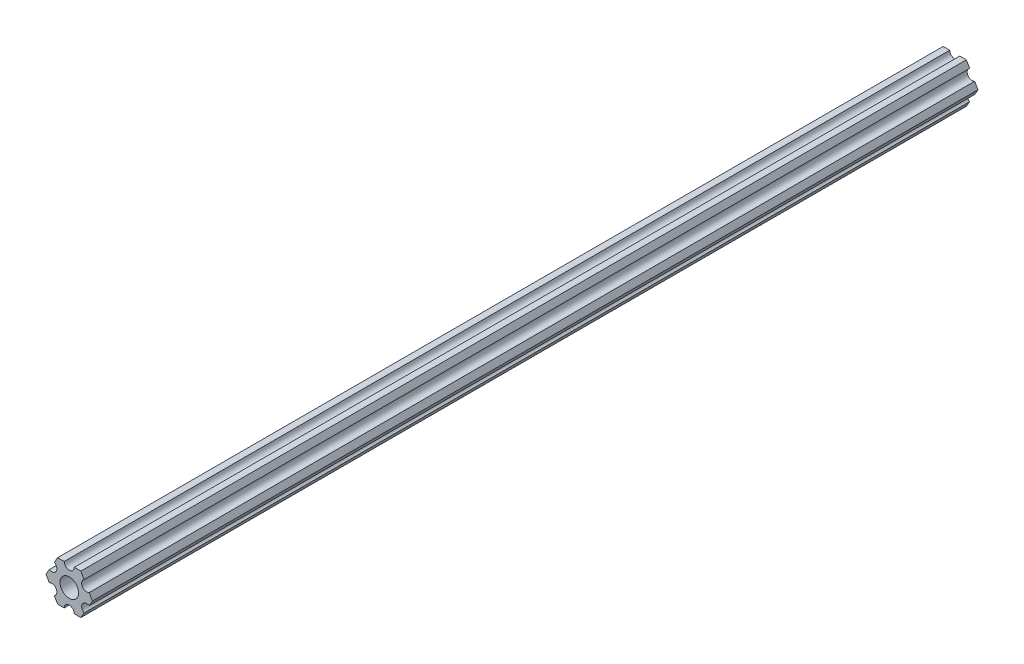
ISO-10303-21;
HEADER;
FILE_DESCRIPTION(('STEP AP214'),'2;1');
FILE_NAME('part.step','',(''),(''),'','','');
FILE_SCHEMA(('AUTOMOTIVE_DESIGN { 1 0 10303 214 1 1 1 1 }'));
ENDSEC;
DATA;
#1=APPLICATION_CONTEXT('core data for automotive mechanical design processes');
#2=APPLICATION_PROTOCOL_DEFINITION('international standard','automotive_design',2000,#1);
#3=PRODUCT_CONTEXT('',#1,'mechanical');
#4=PRODUCT('Part','Part','',(#3));
#5=PRODUCT_RELATED_PRODUCT_CATEGORY('part','',(#4));
#6=PRODUCT_DEFINITION_FORMATION('','',#4);
#7=PRODUCT_DEFINITION_CONTEXT('part definition',#1,'design');
#8=PRODUCT_DEFINITION('design','',#6,#7);
#9=PRODUCT_DEFINITION_SHAPE('','',#8);
#10=(LENGTH_UNIT() NAMED_UNIT(*) SI_UNIT(.MILLI.,.METRE.));
#11=(NAMED_UNIT(*) PLANE_ANGLE_UNIT() SI_UNIT($,.RADIAN.));
#12=(NAMED_UNIT(*) SI_UNIT($,.STERADIAN.) SOLID_ANGLE_UNIT());
#13=UNCERTAINTY_MEASURE_WITH_UNIT(LENGTH_MEASURE(1.E-05),#10,'distance_accuracy_value','');
#14=(GEOMETRIC_REPRESENTATION_CONTEXT(3) GLOBAL_UNCERTAINTY_ASSIGNED_CONTEXT((#13)) GLOBAL_UNIT_ASSIGNED_CONTEXT((#10,
#11,#12)) REPRESENTATION_CONTEXT('',''));
#15=CARTESIAN_POINT('',(0.,0.,0.));
#16=DIRECTION('',(0.,0.,1.));
#17=DIRECTION('',(1.,0.,0.));
#18=AXIS2_PLACEMENT_3D('',#15,#16,#17);
#19=CARTESIAN_POINT('',(6.29301142309098,-1.80018429024546,85.725));
#20=DIRECTION('',(-0.866025434075723,0.499999947533953,0.));
#21=DIRECTION('',(0.,0.,1.));
#22=AXIS2_PLACEMENT_3D('',#19,#20,#21);
#23=PLANE('',#22);
#24=DIRECTION('',(0.,0.,1.));
#25=VECTOR('',#24,1.);
#26=CARTESIAN_POINT('',(7.33234841870827,4.44212519169686E-07,85.725));
#27=LINE('',#26,#25);
#28=CARTESIAN_POINT('',(7.33234841870826,4.44212518961143E-07,-193.675));
#29=VERTEX_POINT('',#28);
#30=CARTESIAN_POINT('',(7.33234841870826,4.44212519315656E-07,85.725));
#31=VERTEX_POINT('',#30);
#32=EDGE_CURVE('E11',#29,#31,#27,.T.);
#33=ORIENTED_EDGE('',*,*,#32,.T.);
#34=DIRECTION('',(0.499999947533953,0.866025434075723,0.));
#35=VECTOR('',#34,1.);
#36=CARTESIAN_POINT('',(6.29301142309098,-1.80018429024546,85.725));
#37=LINE('',#36,#35);
#38=CARTESIAN_POINT('',(6.29301142309098,-1.80018429024546,85.725));
#39=VERTEX_POINT('',#38);
#40=EDGE_CURVE('E301',#39,#31,#37,.T.);
#41=ORIENTED_EDGE('',*,*,#40,.F.);
#42=DIRECTION('',(0.,0.,-1.));
#43=VECTOR('',#42,1.);
#44=CARTESIAN_POINT('',(6.29301142309098,-1.80018429024546,85.725));
#45=LINE('',#44,#43);
#46=CARTESIAN_POINT('',(6.29301142309098,-1.80018429024546,-193.675));
#47=VERTEX_POINT('',#46);
#48=EDGE_CURVE('E300',#39,#47,#45,.T.);
#49=ORIENTED_EDGE('',*,*,#48,.T.);
#50=DIRECTION('',(-0.499999947533953,-0.866025434075723,0.));
#51=VECTOR('',#50,1.);
#52=CARTESIAN_POINT('',(6.29301142309098,-1.80018429024546,-193.675));
#53=LINE('',#52,#51);
#54=EDGE_CURVE('E219',#29,#47,#53,.T.);
#55=ORIENTED_EDGE('',*,*,#54,.F.);
#56=EDGE_LOOP('',(#33,#41,#49,#55));
#57=FACE_BOUND('',#56,.T.);
#58=ADVANCED_FACE('F51',(#57),#23,.F.);
#59=CARTESIAN_POINT('',(7.33234841870827,4.44212519169686E-07,85.725));
#60=DIRECTION('',(-0.866025373493145,-0.500000052466057,0.));
#61=DIRECTION('',(-0.500000052466057,0.866025373493145,0.));
#62=AXIS2_PLACEMENT_3D('',#59,#60,#61);
#63=PLANE('',#62);
#64=DIRECTION('',(0.,0.,1.));
#65=VECTOR('',#64,1.);
#66=CARTESIAN_POINT('',(6.29301120497139,1.80018505273894,85.725));
#67=LINE('',#66,#65);
#68=CARTESIAN_POINT('',(6.29301120497139,1.80018505273894,-193.675));
#69=VERTEX_POINT('',#68);
#70=CARTESIAN_POINT('',(6.29301120497139,1.80018505273894,85.725));
#71=VERTEX_POINT('',#70);
#72=EDGE_CURVE('E59',#69,#71,#67,.T.);
#73=ORIENTED_EDGE('',*,*,#72,.T.);
#74=DIRECTION('',(-0.500000052466057,0.866025373493145,0.));
#75=VECTOR('',#74,1.);
#76=CARTESIAN_POINT('',(7.33234841870827,4.44212519198906E-07,85.725));
#77=LINE('',#76,#75);
#78=EDGE_CURVE('E305',#31,#71,#77,.T.);
#79=ORIENTED_EDGE('',*,*,#78,.F.);
#80=ORIENTED_EDGE('',*,*,#32,.F.);
#81=DIRECTION('',(0.500000052466055,-0.866025373493145,0.));
#82=VECTOR('',#81,1.);
#83=CARTESIAN_POINT('',(7.33234841870826,4.44212518961143E-07,-193.675));
#84=LINE('',#83,#82);
#85=EDGE_CURVE('E213',#69,#29,#84,.T.);
#86=ORIENTED_EDGE('',*,*,#85,.F.);
#87=EDGE_LOOP('',(#73,#79,#80,#86));
#88=FACE_BOUND('',#87,.T.);
#89=ADVANCED_FACE('F214',(#88),#63,.F.);
#90=CARTESIAN_POINT('',(4.70551103839172,4.54981561357972,85.725));
#91=DIRECTION('',(-0.866025373493151,-0.500000052466046,0.));
#92=DIRECTION('',(-0.500000052466046,0.866025373493151,0.));
#93=AXIS2_PLACEMENT_3D('',#90,#91,#92);
#94=PLANE('',#93);
#95=DIRECTION('',(0.,0.,1.));
#96=VECTOR('',#95,1.);
#97=CARTESIAN_POINT('',(3.66617382465481,6.35000022210627,85.725));
#98=LINE('',#97,#96);
#99=CARTESIAN_POINT('',(3.66617382465481,6.35000022210627,-193.675));
#100=VERTEX_POINT('',#99);
#101=CARTESIAN_POINT('',(3.66617382465481,6.35000022210627,85.725));
#102=VERTEX_POINT('',#101);
#103=EDGE_CURVE('E211',#100,#102,#98,.T.);
#104=ORIENTED_EDGE('',*,*,#103,.T.);
#105=DIRECTION('',(-0.500000052466046,0.866025373493151,0.));
#106=VECTOR('',#105,1.);
#107=CARTESIAN_POINT('',(4.70551103839172,4.54981561357972,85.725));
#108=LINE('',#107,#106);
#109=CARTESIAN_POINT('',(4.70551103839172,4.54981561357972,85.725));
#110=VERTEX_POINT('',#109);
#111=EDGE_CURVE('E336',#110,#102,#108,.T.);
#112=ORIENTED_EDGE('',*,*,#111,.F.);
#113=DIRECTION('',(0.,0.,1.));
#114=VECTOR('',#113,1.);
#115=CARTESIAN_POINT('',(4.70551103839172,4.54981561357972,85.725));
#116=LINE('',#115,#114);
#117=CARTESIAN_POINT('',(4.70551103839172,4.54981561357972,-193.675));
#118=VERTEX_POINT('',#117);
#119=EDGE_CURVE('E299',#118,#110,#116,.T.);
#120=ORIENTED_EDGE('',*,*,#119,.F.);
#121=DIRECTION('',(0.500000052466045,-0.866025373493151,0.));
#122=VECTOR('',#121,1.);
#123=CARTESIAN_POINT('',(4.70551103839172,4.54981561357972,-193.675));
#124=LINE('',#123,#122);
#125=EDGE_CURVE('E225',#100,#118,#124,.T.);
#126=ORIENTED_EDGE('',*,*,#125,.F.);
#127=EDGE_LOOP('',(#104,#112,#120,#126));
#128=FACE_BOUND('',#127,.T.);
#129=ADVANCED_FACE('F412',(#128),#94,.F.);
#130=CARTESIAN_POINT('',(3.66617382465481,6.35000022210627,85.725));
#131=DIRECTION('',(6.05825850611185E-08,-1.,0.));
#132=DIRECTION('',(0.,0.,-1.));
#133=AXIS2_PLACEMENT_3D('',#130,#131,#132);
#134=PLANE('',#133);
#135=DIRECTION('',(0.,0.,1.));
#136=VECTOR('',#135,1.);
#137=CARTESIAN_POINT('',(1.58749961530074,6.35000009617482,85.725));
#138=LINE('',#137,#136);
#139=CARTESIAN_POINT('',(1.58749961530073,6.35000015914054,-193.675));
#140=VERTEX_POINT('',#139);
#141=CARTESIAN_POINT('',(1.58749961530073,6.35000015914054,85.725));
#142=VERTEX_POINT('',#141);
#143=EDGE_CURVE('E333',#140,#142,#138,.T.);
#144=ORIENTED_EDGE('',*,*,#143,.T.);
#145=DIRECTION('',(-1.,0.,0.));
#146=VECTOR('',#145,1.);
#147=CARTESIAN_POINT('',(5.49926112168156,6.35000022210627,85.725));
#148=LINE('',#147,#146);
#149=EDGE_CURVE('E340',#102,#142,#148,.T.);
#150=ORIENTED_EDGE('',*,*,#149,.F.);
#151=ORIENTED_EDGE('',*,*,#103,.F.);
#152=DIRECTION('',(1.,3.02912931564594E-08,0.));
#153=VECTOR('',#152,1.);
#154=CARTESIAN_POINT('',(3.66617382465481,6.35000022210627,-193.675));
#155=LINE('',#154,#153);
#156=EDGE_CURVE('E287',#140,#100,#155,.T.);
#157=ORIENTED_EDGE('',*,*,#156,.F.);
#158=EDGE_LOOP('',(#144,#150,#151,#157));
#159=FACE_BOUND('',#158,.T.);
#160=ADVANCED_FACE('F415',(#159),#134,.F.);
#161=CARTESIAN_POINT('',(-3.84699260060323E-07,6.35,85.725));
#162=DIRECTION('',(0.,0.,-1.));
#163=DIRECTION('',(-1.,0.,0.));
#164=AXIS2_PLACEMENT_3D('',#161,#162,#163);
#165=CYLINDRICAL_SURFACE('',#164,1.5875);
#166=DIRECTION('',(0.,0.,1.));
#167=VECTOR('',#166,1.);
#168=CARTESIAN_POINT('',(-1.58750038469926,6.34999990382518,85.725));
#169=LINE('',#168,#167);
#170=CARTESIAN_POINT('',(-1.58750038469926,6.34999990382519,-193.675));
#171=VERTEX_POINT('',#170);
#172=CARTESIAN_POINT('',(-1.58750038469926,6.34999990382519,85.725));
#173=VERTEX_POINT('',#172);
#174=EDGE_CURVE('E330',#171,#173,#169,.T.);
#175=ORIENTED_EDGE('',*,*,#174,.T.);
#176=CARTESIAN_POINT('',(-3.84699260060323E-07,6.35,85.725));
#177=DIRECTION('',(0.,0.,-1.));
#178=DIRECTION('',(-1.,0.,0.));
#179=AXIS2_PLACEMENT_3D('',#176,#177,#178);
#180=CIRCLE('',#179,1.5875);
#181=EDGE_CURVE('E344',#142,#173,#180,.T.);
#182=ORIENTED_EDGE('',*,*,#181,.F.);
#183=ORIENTED_EDGE('',*,*,#143,.F.);
#184=CARTESIAN_POINT('',(-3.84699260060323E-07,6.35,-193.675));
#185=DIRECTION('',(0.,0.,1.));
#186=DIRECTION('',(-1.,0.,0.));
#187=AXIS2_PLACEMENT_3D('',#184,#185,#186);
#188=CIRCLE('',#187,1.5875);
#189=EDGE_CURVE('E283',#171,#140,#188,.T.);
#190=ORIENTED_EDGE('',*,*,#189,.F.);
#191=EDGE_LOOP('',(#175,#182,#183,#190));
#192=FACE_BOUND('',#191,.T.);
#193=ADVANCED_FACE('F464',(#192),#165,.F.);
#194=CARTESIAN_POINT('',(-1.58750038469926,6.34999990382518,85.725));
#195=DIRECTION('',(6.05825963273174E-08,-1.,0.));
#196=DIRECTION('',(0.,0.,-1.));
#197=AXIS2_PLACEMENT_3D('',#194,#195,#196);
#198=PLANE('',#197);
#199=DIRECTION('',(0.,0.,1.));
#200=VECTOR('',#199,1.);
#201=CARTESIAN_POINT('',(-3.66617459405349,6.3499997778937,85.725));
#202=LINE('',#201,#200);
#203=CARTESIAN_POINT('',(-3.66617454558244,6.34999986184803,-193.675));
#204=VERTEX_POINT('',#203);
#205=CARTESIAN_POINT('',(-3.66617454558244,6.34999986184803,85.725));
#206=VERTEX_POINT('',#205);
#207=EDGE_CURVE('E323',#204,#206,#202,.T.);
#208=ORIENTED_EDGE('',*,*,#207,.T.);
#209=DIRECTION('',(-1.,0.,0.));
#210=VECTOR('',#209,1.);
#211=CARTESIAN_POINT('',(5.49926112168156,6.34999990382519,85.725));
#212=LINE('',#211,#210);
#213=EDGE_CURVE('E348',#173,#206,#212,.T.);
#214=ORIENTED_EDGE('',*,*,#213,.F.);
#215=ORIENTED_EDGE('',*,*,#174,.F.);
#216=DIRECTION('',(1.,2.0194198968488E-08,0.));
#217=VECTOR('',#216,1.);
#218=CARTESIAN_POINT('',(-1.58750038469926,6.34999990382519,-193.675));
#219=LINE('',#218,#217);
#220=EDGE_CURVE('E279',#204,#171,#219,.T.);
#221=ORIENTED_EDGE('',*,*,#220,.F.);
#222=EDGE_LOOP('',(#208,#214,#215,#221));
#223=FACE_BOUND('',#222,.T.);
#224=ADVANCED_FACE('F461',(#223),#198,.F.);
#225=CARTESIAN_POINT('',(-3.66617459405349,6.3499997778937,85.725));
#226=DIRECTION('',(0.866025434075729,-0.499999947533942,0.));
#227=DIRECTION('',(0.,0.,-1.));
#228=AXIS2_PLACEMENT_3D('',#225,#226,#227);
#229=PLANE('',#228);
#230=DIRECTION('',(0.,0.,1.));
#231=VECTOR('',#230,1.);
#232=CARTESIAN_POINT('',(-4.70551158967065,4.54981504343587,85.725));
#233=LINE('',#232,#231);
#234=CARTESIAN_POINT('',(-4.70551158967065,4.54981504343587,-193.675));
#235=VERTEX_POINT('',#234);
#236=CARTESIAN_POINT('',(-4.70551158967065,4.54981504343587,85.725));
#237=VERTEX_POINT('',#236);
#238=EDGE_CURVE('E320',#235,#237,#233,.T.);
#239=ORIENTED_EDGE('',*,*,#238,.T.);
#240=DIRECTION('',(-0.499999947533943,-0.866025434075729,0.));
#241=VECTOR('',#240,1.);
#242=CARTESIAN_POINT('',(-3.66617459405349,6.3499997778937,85.725));
#243=LINE('',#242,#241);
#244=EDGE_CURVE('E352',#206,#237,#243,.T.);
#245=ORIENTED_EDGE('',*,*,#244,.F.);
#246=ORIENTED_EDGE('',*,*,#207,.F.);
#247=DIRECTION('',(0.499999947533939,0.866025434075731,0.));
#248=VECTOR('',#247,1.);
#249=CARTESIAN_POINT('',(-3.66617454558244,6.34999986184803,-193.675));
#250=LINE('',#249,#248);
#251=EDGE_CURVE('E275',#235,#204,#250,.T.);
#252=ORIENTED_EDGE('',*,*,#251,.F.);
#253=EDGE_LOOP('',(#239,#245,#246,#252));
#254=FACE_BOUND('',#253,.T.);
#255=ADVANCED_FACE('F457',(#254),#229,.F.);
#256=CARTESIAN_POINT('',(-5.49926150638082,3.17499966684067,85.725));
#257=DIRECTION('',(0.,0.,-1.));
#258=DIRECTION('',(-1.,0.,0.));
#259=AXIS2_PLACEMENT_3D('',#256,#257,#258);
#260=CYLINDRICAL_SURFACE('',#259,1.5875);
#261=DIRECTION('',(0.,0.,1.));
#262=VECTOR('',#261,1.);
#263=CARTESIAN_POINT('',(-6.29301142309098,1.80018429024547,85.725));
#264=LINE('',#263,#262);
#265=CARTESIAN_POINT('',(-6.29301142309098,1.80018429024546,-193.675));
#266=VERTEX_POINT('',#265);
#267=CARTESIAN_POINT('',(-6.29301142309098,1.80018429024547,85.725));
#268=VERTEX_POINT('',#267);
#269=EDGE_CURVE('E324',#266,#268,#264,.T.);
#270=ORIENTED_EDGE('',*,*,#269,.T.);
#271=CARTESIAN_POINT('',(-5.49926150638082,3.17499966684067,85.725));
#272=DIRECTION('',(0.,0.,-1.));
#273=DIRECTION('',(-1.,0.,0.));
#274=AXIS2_PLACEMENT_3D('',#271,#272,#273);
#275=CIRCLE('',#274,1.5875);
#276=EDGE_CURVE('E362',#237,#268,#275,.T.);
#277=ORIENTED_EDGE('',*,*,#276,.F.);
#278=ORIENTED_EDGE('',*,*,#238,.F.);
#279=CARTESIAN_POINT('',(-5.49926150638082,3.17499966684067,-193.675));
#280=DIRECTION('',(0.,0.,1.));
#281=DIRECTION('',(-1.,0.,0.));
#282=AXIS2_PLACEMENT_3D('',#279,#280,#281);
#283=CIRCLE('',#282,1.5875);
#284=EDGE_CURVE('E271',#266,#235,#283,.T.);
#285=ORIENTED_EDGE('',*,*,#284,.F.);
#286=EDGE_LOOP('',(#270,#277,#278,#285));
#287=FACE_BOUND('',#286,.T.);
#288=ADVANCED_FACE('F453',(#287),#260,.F.);
#289=CARTESIAN_POINT('',(-6.29301142309098,1.80018429024547,85.725));
#290=DIRECTION('',(0.866025434075724,-0.499999947533952,0.));
#291=DIRECTION('',(0.,0.,-1.));
#292=AXIS2_PLACEMENT_3D('',#289,#290,#291);
#293=PLANE('',#292);
#294=DIRECTION('',(0.,0.,1.));
#295=VECTOR('',#294,1.);
#296=CARTESIAN_POINT('',(-7.33234841870827,-4.44212523790841E-07,85.725));
#297=LINE('',#296,#295);
#298=CARTESIAN_POINT('',(-7.33234841870826,-4.44212524036367E-07,-193.675));
#299=VERTEX_POINT('',#298);
#300=CARTESIAN_POINT('',(-7.33234841870826,-4.44212524036367E-07,85.725));
#301=VERTEX_POINT('',#300);
#302=EDGE_CURVE('E317',#299,#301,#297,.T.);
#303=ORIENTED_EDGE('',*,*,#302,.T.);
#304=DIRECTION('',(-0.499999947533952,-0.866025434075724,0.));
#305=VECTOR('',#304,1.);
#306=CARTESIAN_POINT('',(-6.29301142309098,1.80018429024547,85.725));
#307=LINE('',#306,#305);
#308=EDGE_CURVE('E358',#268,#301,#307,.T.);
#309=ORIENTED_EDGE('',*,*,#308,.F.);
#310=ORIENTED_EDGE('',*,*,#269,.F.);
#311=DIRECTION('',(0.499999947533951,0.866025434075724,0.));
#312=VECTOR('',#311,1.);
#313=CARTESIAN_POINT('',(-6.29301142309098,1.80018429024547,-193.675));
#314=LINE('',#313,#312);
#315=EDGE_CURVE('E267',#299,#266,#314,.T.);
#316=ORIENTED_EDGE('',*,*,#315,.F.);
#317=EDGE_LOOP('',(#303,#309,#310,#316));
#318=FACE_BOUND('',#317,.T.);
#319=ADVANCED_FACE('F449',(#318),#293,.F.);
#320=CARTESIAN_POINT('',(-7.33234841870827,-4.44212523790841E-07,85.725));
#321=DIRECTION('',(0.866025373493151,0.500000052466045,0.));
#322=DIRECTION('',(0.,0.,-1.));
#323=AXIS2_PLACEMENT_3D('',#320,#321,#322);
#324=PLANE('',#323);
#325=DIRECTION('',(0.,0.,1.));
#326=VECTOR('',#325,1.);
#327=CARTESIAN_POINT('',(-6.29301120497141,-1.80018505273897,85.725));
#328=LINE('',#327,#326);
#329=CARTESIAN_POINT('',(-6.29301120497141,-1.80018505273897,-193.675));
#330=VERTEX_POINT('',#329);
#331=CARTESIAN_POINT('',(-6.29301120497141,-1.80018505273897,85.725));
#332=VERTEX_POINT('',#331);
#333=EDGE_CURVE('E310',#330,#332,#328,.T.);
#334=ORIENTED_EDGE('',*,*,#333,.T.);
#335=DIRECTION('',(0.500000052466045,-0.866025373493151,0.));
#336=VECTOR('',#335,1.);
#337=CARTESIAN_POINT('',(-7.33234841870827,-4.44212523969395E-07,85.725));
#338=LINE('',#337,#336);
#339=EDGE_CURVE('E353',#301,#332,#338,.T.);
#340=ORIENTED_EDGE('',*,*,#339,.F.);
#341=ORIENTED_EDGE('',*,*,#302,.F.);
#342=DIRECTION('',(-0.500000052466045,0.866025373493152,0.));
#343=VECTOR('',#342,1.);
#344=CARTESIAN_POINT('',(-7.33234841870826,-4.44212524036367E-07,-193.675));
#345=LINE('',#344,#343);
#346=EDGE_CURVE('E263',#330,#299,#345,.T.);
#347=ORIENTED_EDGE('',*,*,#346,.F.);
#348=EDGE_LOOP('',(#334,#340,#341,#347));
#349=FACE_BOUND('',#348,.T.);
#350=ADVANCED_FACE('F445',(#349),#324,.F.);
#351=CARTESIAN_POINT('',(-5.49926112168156,-3.17500033315934,85.725));
#352=DIRECTION('',(0.,0.,-1.));
#353=DIRECTION('',(-1.,0.,0.));
#354=AXIS2_PLACEMENT_3D('',#351,#352,#353);
#355=CYLINDRICAL_SURFACE('',#354,1.5875);
#356=DIRECTION('',(0.,0.,1.));
#357=VECTOR('',#356,1.);
#358=CARTESIAN_POINT('',(-4.70551103839172,-4.54981561357972,85.725));
#359=LINE('',#358,#357);
#360=CARTESIAN_POINT('',(-4.70551103839172,-4.54981561357972,-193.675));
#361=VERTEX_POINT('',#360);
#362=CARTESIAN_POINT('',(-4.70551103839172,-4.54981561357972,85.725));
#363=VERTEX_POINT('',#362);
#364=EDGE_CURVE('E307',#361,#363,#359,.T.);
#365=ORIENTED_EDGE('',*,*,#364,.T.);
#366=CARTESIAN_POINT('',(-5.49926112168156,-3.17500033315934,85.725));
#367=DIRECTION('',(0.,0.,-1.));
#368=DIRECTION('',(-1.,0.,0.));
#369=AXIS2_PLACEMENT_3D('',#366,#367,#368);
#370=CIRCLE('',#369,1.5875);
#371=EDGE_CURVE('E357',#332,#363,#370,.T.);
#372=ORIENTED_EDGE('',*,*,#371,.F.);
#373=ORIENTED_EDGE('',*,*,#333,.F.);
#374=CARTESIAN_POINT('',(-5.49926112168156,-3.17500033315934,-193.675));
#375=DIRECTION('',(0.,0.,1.));
#376=DIRECTION('',(-1.,0.,0.));
#377=AXIS2_PLACEMENT_3D('',#374,#375,#376);
#378=CIRCLE('',#377,1.5875);
#379=EDGE_CURVE('E259',#361,#330,#378,.T.);
#380=ORIENTED_EDGE('',*,*,#379,.F.);
#381=EDGE_LOOP('',(#365,#372,#373,#380));
#382=FACE_BOUND('',#381,.T.);
#383=ADVANCED_FACE('F441',(#382),#355,.F.);
#384=CARTESIAN_POINT('',(-4.70551103839172,-4.54981561357972,85.725));
#385=DIRECTION('',(0.866025373493152,0.500000052466045,0.));
#386=DIRECTION('',(0.,0.,-1.));
#387=AXIS2_PLACEMENT_3D('',#384,#385,#386);
#388=PLANE('',#387);
#389=DIRECTION('',(0.,0.,1.));
#390=VECTOR('',#389,1.);
#391=CARTESIAN_POINT('',(-3.66617382465481,-6.35000022210628,85.725));
#392=LINE('',#391,#390);
#393=CARTESIAN_POINT('',(-3.66617382465481,-6.35000022210628,-193.675));
#394=VERTEX_POINT('',#393);
#395=CARTESIAN_POINT('',(-3.66617382465481,-6.35000022210628,85.725));
#396=VERTEX_POINT('',#395);
#397=EDGE_CURVE('E311',#394,#396,#392,.T.);
#398=ORIENTED_EDGE('',*,*,#397,.T.);
#399=DIRECTION('',(0.500000052466045,-0.866025373493151,0.));
#400=VECTOR('',#399,1.);
#401=CARTESIAN_POINT('',(-4.70551103839172,-4.54981561357972,85.725));
#402=LINE('',#401,#400);
#403=EDGE_CURVE('E372',#363,#396,#402,.T.);
#404=ORIENTED_EDGE('',*,*,#403,.F.);
#405=ORIENTED_EDGE('',*,*,#364,.F.);
#406=DIRECTION('',(-0.500000052466043,0.866025373493152,0.));
#407=VECTOR('',#406,1.);
#408=CARTESIAN_POINT('',(-4.70551103839172,-4.54981561357972,-193.675));
#409=LINE('',#408,#407);
#410=EDGE_CURVE('E255',#394,#361,#409,.T.);
#411=ORIENTED_EDGE('',*,*,#410,.F.);
#412=EDGE_LOOP('',(#398,#404,#405,#411));
#413=FACE_BOUND('',#412,.T.);
#414=ADVANCED_FACE('F437',(#413),#388,.F.);
#415=CARTESIAN_POINT('',(-3.66617382465481,-6.35000022210628,85.725));
#416=DIRECTION('',(-6.05825854783851E-08,1.,0.));
#417=DIRECTION('',(0.,0.,1.));
#418=AXIS2_PLACEMENT_3D('',#415,#416,#417);
#419=PLANE('',#418);
#420=DIRECTION('',(0.,0.,1.));
#421=VECTOR('',#420,1.);
#422=CARTESIAN_POINT('',(-1.58749961530074,-6.35,85.725));
#423=LINE('',#422,#421);
#424=CARTESIAN_POINT('',(-1.58749961530073,-6.35000011105314,-193.675));
#425=VERTEX_POINT('',#424);
#426=CARTESIAN_POINT('',(-1.58749961530073,-6.35000011105314,85.725));
#427=VERTEX_POINT('',#426);
#428=EDGE_CURVE('E82',#425,#427,#423,.T.);
#429=ORIENTED_EDGE('',*,*,#428,.T.);
#430=DIRECTION('',(1.,0.,0.));
#431=VECTOR('',#430,1.);
#432=CARTESIAN_POINT('',(5.49926112168156,-6.35000022210628,85.725));
#433=LINE('',#432,#431);
#434=EDGE_CURVE('E376',#396,#427,#433,.T.);
#435=ORIENTED_EDGE('',*,*,#434,.F.);
#436=ORIENTED_EDGE('',*,*,#397,.F.);
#437=DIRECTION('',(-0.999999999999999,-5.34249856349036E-08,0.));
#438=VECTOR('',#437,1.);
#439=CARTESIAN_POINT('',(-3.66617382465481,-6.35000022210628,-193.675));
#440=LINE('',#439,#438);
#441=EDGE_CURVE('E251',#425,#394,#440,.T.);
#442=ORIENTED_EDGE('',*,*,#441,.F.);
#443=EDGE_LOOP('',(#429,#435,#436,#442));
#444=FACE_BOUND('',#443,.T.);
#445=ADVANCED_FACE('F434',(#444),#419,.F.);
#446=CARTESIAN_POINT('',(3.8469926204343E-07,-6.35,85.725));
#447=DIRECTION('',(0.,0.,-1.));
#448=DIRECTION('',(-1.,0.,0.));
#449=AXIS2_PLACEMENT_3D('',#446,#447,#448);
#450=CYLINDRICAL_SURFACE('',#449,1.5875);
#451=DIRECTION('',(0.,0.,1.));
#452=VECTOR('',#451,1.);
#453=CARTESIAN_POINT('',(1.58750038469926,-6.34999990382518,85.725));
#454=LINE('',#453,#452);
#455=CARTESIAN_POINT('',(1.58750038469926,-6.34999990382519,-193.675));
#456=VERTEX_POINT('',#455);
#457=CARTESIAN_POINT('',(1.58750038469926,-6.34999990382519,85.725));
#458=VERTEX_POINT('',#457);
#459=EDGE_CURVE('E71',#456,#458,#454,.T.);
#460=ORIENTED_EDGE('',*,*,#459,.T.);
#461=CARTESIAN_POINT('',(3.8469926204343E-07,-6.35,85.725));
#462=DIRECTION('',(0.,0.,-1.));
#463=DIRECTION('',(-1.,0.,0.));
#464=AXIS2_PLACEMENT_3D('',#461,#462,#463);
#465=CIRCLE('',#464,1.5875);
#466=EDGE_CURVE('E380',#427,#458,#465,.T.);
#467=ORIENTED_EDGE('',*,*,#466,.F.);
#468=ORIENTED_EDGE('',*,*,#428,.F.);
#469=CARTESIAN_POINT('',(3.8469926204343E-07,-6.35,-193.675));
#470=DIRECTION('',(0.,0.,1.));
#471=DIRECTION('',(-1.,0.,0.));
#472=AXIS2_PLACEMENT_3D('',#469,#470,#471);
#473=CIRCLE('',#472,1.5875);
#474=EDGE_CURVE('E247',#456,#425,#473,.T.);
#475=ORIENTED_EDGE('',*,*,#474,.F.);
#476=EDGE_LOOP('',(#460,#467,#468,#475));
#477=FACE_BOUND('',#476,.T.);
#478=ADVANCED_FACE('F432',(#477),#450,.F.);
#479=CARTESIAN_POINT('',(1.58750038469926,-6.34999990382518,85.725));
#480=DIRECTION('',(-6.05825721258438E-08,1.,0.));
#481=DIRECTION('',(0.,0.,1.));
#482=AXIS2_PLACEMENT_3D('',#479,#480,#481);
#483=PLANE('',#482);
#484=DIRECTION('',(0.,0.,1.));
#485=VECTOR('',#484,1.);
#486=CARTESIAN_POINT('',(3.66617459405346,-6.34999977789375,85.725));
#487=LINE('',#486,#485);
#488=CARTESIAN_POINT('',(3.66617454558244,-6.34999986184804,-193.675));
#489=VERTEX_POINT('',#488);
#490=CARTESIAN_POINT('',(3.66617454558244,-6.34999986184804,85.725));
#491=VERTEX_POINT('',#490);
#492=EDGE_CURVE('E381',#489,#491,#487,.T.);
#493=ORIENTED_EDGE('',*,*,#492,.T.);
#494=DIRECTION('',(1.,0.,0.));
#495=VECTOR('',#494,1.);
#496=CARTESIAN_POINT('',(5.49926112168156,-6.34999990382519,85.725));
#497=LINE('',#496,#495);
#498=EDGE_CURVE('E388',#458,#491,#497,.T.);
#499=ORIENTED_EDGE('',*,*,#498,.F.);
#500=ORIENTED_EDGE('',*,*,#459,.F.);
#501=DIRECTION('',(-1.,-2.01941943785532E-08,0.));
#502=VECTOR('',#501,1.);
#503=CARTESIAN_POINT('',(1.58750038469926,-6.34999990382519,-193.675));
#504=LINE('',#503,#502);
#505=EDGE_CURVE('E243',#489,#456,#504,.T.);
#506=ORIENTED_EDGE('',*,*,#505,.F.);
#507=EDGE_LOOP('',(#493,#499,#500,#506));
#508=FACE_BOUND('',#507,.T.);
#509=ADVANCED_FACE('F431',(#508),#483,.F.);
#510=CARTESIAN_POINT('',(3.66617459405346,-6.34999977789375,85.725));
#511=DIRECTION('',(-0.86602543407573,0.499999947533941,0.));
#512=DIRECTION('',(0.,0.,1.));
#513=AXIS2_PLACEMENT_3D('',#510,#511,#512);
#514=PLANE('',#513);
#515=DIRECTION('',(0.,0.,-1.));
#516=VECTOR('',#515,1.);
#517=CARTESIAN_POINT('',(4.70551158967065,-4.54981504343587,85.725));
#518=LINE('',#517,#516);
#519=CARTESIAN_POINT('',(4.70551158967065,-4.54981504343587,85.725));
#520=VERTEX_POINT('',#519);
#521=CARTESIAN_POINT('',(4.70551158967065,-4.54981504343587,-193.675));
#522=VERTEX_POINT('',#521);
#523=EDGE_CURVE('E384',#520,#522,#518,.T.);
#524=ORIENTED_EDGE('',*,*,#523,.F.);
#525=DIRECTION('',(0.49999994753394,0.86602543407573,0.));
#526=VECTOR('',#525,1.);
#527=CARTESIAN_POINT('',(3.66617459405346,-6.34999977789376,85.725));
#528=LINE('',#527,#526);
#529=EDGE_CURVE('E306',#491,#520,#528,.T.);
#530=ORIENTED_EDGE('',*,*,#529,.F.);
#531=ORIENTED_EDGE('',*,*,#492,.F.);
#532=DIRECTION('',(-0.499999947533941,-0.86602543407573,0.));
#533=VECTOR('',#532,1.);
#534=CARTESIAN_POINT('',(3.66617454558244,-6.34999986184804,-193.675));
#535=LINE('',#534,#533);
#536=EDGE_CURVE('E239',#522,#489,#535,.T.);
#537=ORIENTED_EDGE('',*,*,#536,.F.);
#538=EDGE_LOOP('',(#524,#530,#531,#537));
#539=FACE_BOUND('',#538,.T.);
#540=ADVANCED_FACE('F428',(#539),#514,.F.);
#541=CARTESIAN_POINT('',(5.49926112168156,3.17500033315934,85.725));
#542=DIRECTION('',(0.,0.,1.));
#543=DIRECTION('',(1.,0.,0.));
#544=AXIS2_PLACEMENT_3D('',#541,#542,#543);
#545=PLANE('',#544);
#546=CARTESIAN_POINT('',(0.,0.,85.725));
#547=DIRECTION('',(0.,0.,-1.));
#548=DIRECTION('',(-1.,0.,0.));
#549=AXIS2_PLACEMENT_3D('',#546,#547,#548);
#550=CIRCLE('',#549,2.9337);
#551=CARTESIAN_POINT('',(-2.9337,0.,85.725));
#552=VERTEX_POINT('',#551);
#553=EDGE_CURVE('E292',#552,#552,#550,.T.);
#554=ORIENTED_EDGE('',*,*,#553,.T.);
#555=EDGE_LOOP('',(#554));
#556=FACE_BOUND('',#555,.T.);
#557=ORIENTED_EDGE('',*,*,#529,.T.);
#558=CARTESIAN_POINT('',(5.49926150638082,-3.17499966684067,85.725));
#559=DIRECTION('',(0.,0.,-1.));
#560=DIRECTION('',(-1.,0.,0.));
#561=AXIS2_PLACEMENT_3D('',#558,#559,#560);
#562=CIRCLE('',#561,1.5875);
#563=EDGE_CURVE('E296',#520,#39,#562,.T.);
#564=ORIENTED_EDGE('',*,*,#563,.T.);
#565=ORIENTED_EDGE('',*,*,#40,.T.);
#566=ORIENTED_EDGE('',*,*,#78,.T.);
#567=CARTESIAN_POINT('',(5.49926112168156,3.17500033315934,85.725));
#568=DIRECTION('',(0.,0.,-1.));
#569=DIRECTION('',(-1.,0.,0.));
#570=AXIS2_PLACEMENT_3D('',#567,#568,#569);
#571=CIRCLE('',#570,1.5875);
#572=EDGE_CURVE('E206',#71,#110,#571,.T.);
#573=ORIENTED_EDGE('',*,*,#572,.T.);
#574=ORIENTED_EDGE('',*,*,#111,.T.);
#575=ORIENTED_EDGE('',*,*,#149,.T.);
#576=ORIENTED_EDGE('',*,*,#181,.T.);
#577=ORIENTED_EDGE('',*,*,#213,.T.);
#578=ORIENTED_EDGE('',*,*,#244,.T.);
#579=ORIENTED_EDGE('',*,*,#276,.T.);
#580=ORIENTED_EDGE('',*,*,#308,.T.);
#581=ORIENTED_EDGE('',*,*,#339,.T.);
#582=ORIENTED_EDGE('',*,*,#371,.T.);
#583=ORIENTED_EDGE('',*,*,#403,.T.);
#584=ORIENTED_EDGE('',*,*,#434,.T.);
#585=ORIENTED_EDGE('',*,*,#466,.T.);
#586=ORIENTED_EDGE('',*,*,#498,.T.);
#587=EDGE_LOOP('',(#557,#564,#565,#566,#573,#574,#575,#576,#577,#578,#579,#580,#581,#582,#583,
#584,#585,#586));
#588=FACE_BOUND('',#587,.T.);
#589=ADVANCED_FACE('F418',(#556,#588),#545,.T.);
#590=CARTESIAN_POINT('',(5.49926112168156,3.17500033315934,85.725));
#591=DIRECTION('',(0.,0.,-1.));
#592=DIRECTION('',(-1.,0.,0.));
#593=AXIS2_PLACEMENT_3D('',#590,#591,#592);
#594=CYLINDRICAL_SURFACE('',#593,1.5875);
#595=ORIENTED_EDGE('',*,*,#572,.F.);
#596=ORIENTED_EDGE('',*,*,#72,.F.);
#597=CARTESIAN_POINT('',(5.49926112168156,3.17500033315934,-193.675));
#598=DIRECTION('',(0.,0.,1.));
#599=DIRECTION('',(-1.,0.,0.));
#600=AXIS2_PLACEMENT_3D('',#597,#598,#599);
#601=CIRCLE('',#600,1.5875);
#602=EDGE_CURVE('E203',#118,#69,#601,.T.);
#603=ORIENTED_EDGE('',*,*,#602,.F.);
#604=ORIENTED_EDGE('',*,*,#119,.T.);
#605=EDGE_LOOP('',(#595,#596,#603,#604));
#606=FACE_BOUND('',#605,.T.);
#607=ADVANCED_FACE('F200',(#606),#594,.F.);
#608=CARTESIAN_POINT('',(5.49926150638082,-3.17499966684067,85.725));
#609=DIRECTION('',(0.,0.,-1.));
#610=DIRECTION('',(-1.,0.,0.));
#611=AXIS2_PLACEMENT_3D('',#608,#609,#610);
#612=CYLINDRICAL_SURFACE('',#611,1.5875);
#613=ORIENTED_EDGE('',*,*,#563,.F.);
#614=ORIENTED_EDGE('',*,*,#523,.T.);
#615=CARTESIAN_POINT('',(5.49926150638082,-3.17499966684067,-193.675));
#616=DIRECTION('',(0.,0.,1.));
#617=DIRECTION('',(-1.,0.,0.));
#618=AXIS2_PLACEMENT_3D('',#615,#616,#617);
#619=CIRCLE('',#618,1.5875);
#620=EDGE_CURVE('E235',#47,#522,#619,.T.);
#621=ORIENTED_EDGE('',*,*,#620,.F.);
#622=ORIENTED_EDGE('',*,*,#48,.F.);
#623=EDGE_LOOP('',(#613,#614,#621,#622));
#624=FACE_BOUND('',#623,.T.);
#625=ADVANCED_FACE('F423',(#624),#612,.F.);
#626=CARTESIAN_POINT('',(0.,0.,85.725));
#627=DIRECTION('',(0.,0.,-1.));
#628=DIRECTION('',(-1.,0.,0.));
#629=AXIS2_PLACEMENT_3D('',#626,#627,#628);
#630=CYLINDRICAL_SURFACE('',#629,2.9337);
#631=ORIENTED_EDGE('',*,*,#553,.F.);
#632=EDGE_LOOP('',(#631));
#633=FACE_BOUND('',#632,.T.);
#634=CARTESIAN_POINT('',(0.,0.,-193.675));
#635=DIRECTION('',(0.,0.,-1.));
#636=DIRECTION('',(-1.,0.,0.));
#637=AXIS2_PLACEMENT_3D('',#634,#635,#636);
#638=CIRCLE('',#637,2.9337);
#639=CARTESIAN_POINT('',(-2.9337,0.,-193.675));
#640=VERTEX_POINT('',#639);
#641=EDGE_CURVE('E227',#640,#640,#638,.T.);
#642=ORIENTED_EDGE('',*,*,#641,.T.);
#643=EDGE_LOOP('',(#642));
#644=FACE_BOUND('',#643,.T.);
#645=ADVANCED_FACE('F483',(#633,#644),#630,.F.);
#646=CARTESIAN_POINT('',(5.49926112168156,3.17500033315934,-193.675));
#647=DIRECTION('',(0.,0.,-1.));
#648=DIRECTION('',(-1.,0.,0.));
#649=AXIS2_PLACEMENT_3D('',#646,#647,#648);
#650=PLANE('',#649);
#651=ORIENTED_EDGE('',*,*,#602,.T.);
#652=ORIENTED_EDGE('',*,*,#85,.T.);
#653=ORIENTED_EDGE('',*,*,#54,.T.);
#654=ORIENTED_EDGE('',*,*,#620,.T.);
#655=ORIENTED_EDGE('',*,*,#536,.T.);
#656=ORIENTED_EDGE('',*,*,#505,.T.);
#657=ORIENTED_EDGE('',*,*,#474,.T.);
#658=ORIENTED_EDGE('',*,*,#441,.T.);
#659=ORIENTED_EDGE('',*,*,#410,.T.);
#660=ORIENTED_EDGE('',*,*,#379,.T.);
#661=ORIENTED_EDGE('',*,*,#346,.T.);
#662=ORIENTED_EDGE('',*,*,#315,.T.);
#663=ORIENTED_EDGE('',*,*,#284,.T.);
#664=ORIENTED_EDGE('',*,*,#251,.T.);
#665=ORIENTED_EDGE('',*,*,#220,.T.);
#666=ORIENTED_EDGE('',*,*,#189,.T.);
#667=ORIENTED_EDGE('',*,*,#156,.T.);
#668=ORIENTED_EDGE('',*,*,#125,.T.);
#669=EDGE_LOOP('',(#651,#652,#653,#654,#655,#656,#657,#658,#659,#660,#661,#662,#663,#664,#665,
#666,#667,#668));
#670=FACE_BOUND('',#669,.T.);
#671=ORIENTED_EDGE('',*,*,#641,.F.);
#672=EDGE_LOOP('',(#671));
#673=FACE_BOUND('',#672,.T.);
#674=ADVANCED_FACE('F221',(#670,#673),#650,.T.);
#675=CLOSED_SHELL('',(#58,#89,#129,#160,#193,#224,#255,#288,#319,#350,#383,#414,#445,#478,#509,
#540,#589,#607,#625,#645,#674));
#676=MANIFOLD_SOLID_BREP('B2',#675);
#677=ADVANCED_BREP_SHAPE_REPRESENTATION('',(#18,#676),#14);
#678=SHAPE_DEFINITION_REPRESENTATION(#9,#677);
ENDSEC;
END-ISO-10303-21;
